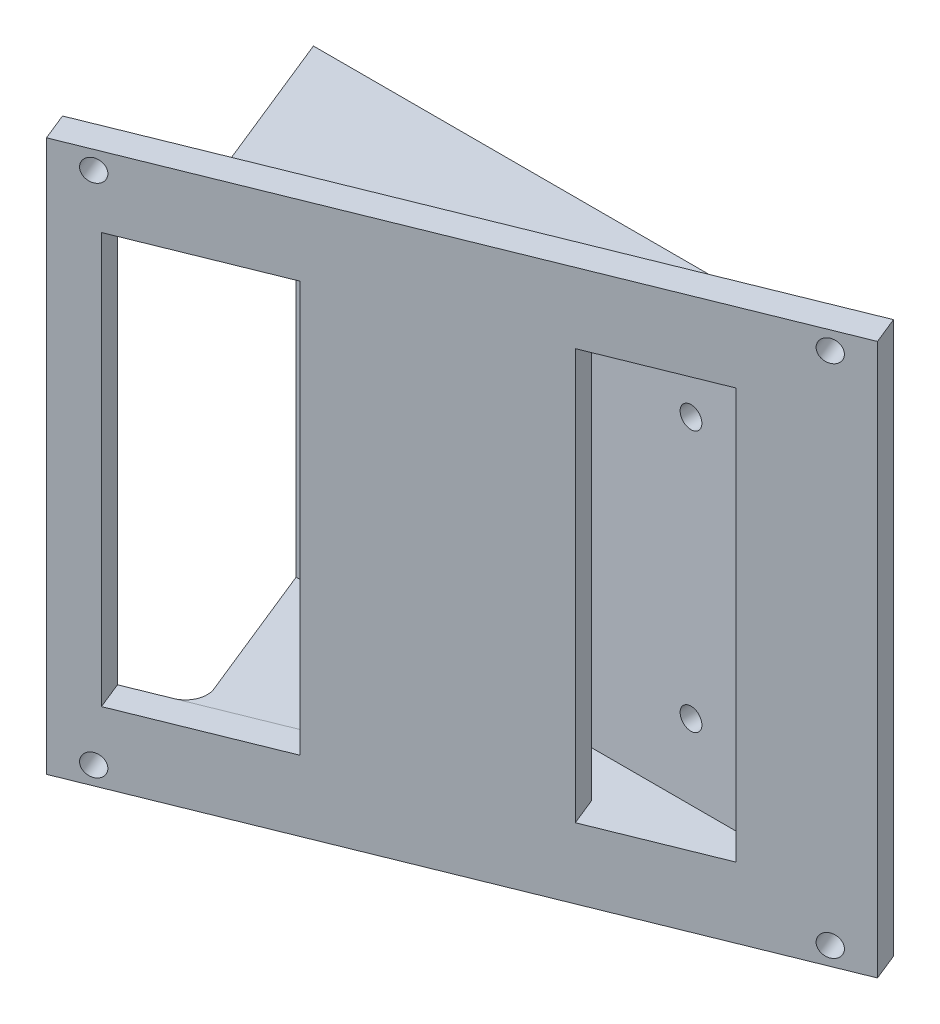
ISO-10303-21;
HEADER;
FILE_DESCRIPTION(('STEP AP214'),'2;1');
FILE_NAME('part.step','',(''),(''),'','','');
FILE_SCHEMA(('AUTOMOTIVE_DESIGN { 1 0 10303 214 1 1 1 1 }'));
ENDSEC;
DATA;
#1=APPLICATION_CONTEXT('core data for automotive mechanical design processes');
#2=APPLICATION_PROTOCOL_DEFINITION('international standard','automotive_design',2000,#1);
#3=PRODUCT_CONTEXT('',#1,'mechanical');
#4=PRODUCT('Part','Part','',(#3));
#5=PRODUCT_RELATED_PRODUCT_CATEGORY('part','',(#4));
#6=PRODUCT_DEFINITION_FORMATION('','',#4);
#7=PRODUCT_DEFINITION_CONTEXT('part definition',#1,'design');
#8=PRODUCT_DEFINITION('design','',#6,#7);
#9=PRODUCT_DEFINITION_SHAPE('','',#8);
#10=(LENGTH_UNIT() NAMED_UNIT(*) SI_UNIT(.MILLI.,.METRE.));
#11=(NAMED_UNIT(*) PLANE_ANGLE_UNIT() SI_UNIT($,.RADIAN.));
#12=(NAMED_UNIT(*) SI_UNIT($,.STERADIAN.) SOLID_ANGLE_UNIT());
#13=UNCERTAINTY_MEASURE_WITH_UNIT(LENGTH_MEASURE(1.E-05),#10,'distance_accuracy_value','');
#14=(GEOMETRIC_REPRESENTATION_CONTEXT(3) GLOBAL_UNCERTAINTY_ASSIGNED_CONTEXT((#13)) GLOBAL_UNIT_ASSIGNED_CONTEXT((#10,
#11,#12)) REPRESENTATION_CONTEXT('',''));
#15=CARTESIAN_POINT('',(0.,0.,0.));
#16=DIRECTION('',(0.,0.,1.));
#17=DIRECTION('',(1.,0.,0.));
#18=AXIS2_PLACEMENT_3D('',#15,#16,#17);
#19=CARTESIAN_POINT('',(-25.5235857504545,-32.41699308692,24.166235419299));
#20=DIRECTION('',(0.,-1.,0.));
#21=DIRECTION('',(0.,0.,-1.));
#22=AXIS2_PLACEMENT_3D('',#19,#20,#21);
#23=CYLINDRICAL_SURFACE('',#22,3.);
#24=DIRECTION('',(0.,1.,0.));
#25=VECTOR('',#24,1.);
#26=CARTESIAN_POINT('',(-22.7420684137299,-32.41699308692,23.0423309280274));
#27=LINE('',#26,#25);
#28=CARTESIAN_POINT('',(-22.7420684137299,28.28300691308,23.0423309280274));
#29=VERTEX_POINT('',#28);
#30=CARTESIAN_POINT('',(-22.7420684137299,32.28300691308,23.0423309280274));
#31=VERTEX_POINT('',#30);
#32=EDGE_CURVE('E192',#29,#31,#27,.T.);
#33=ORIENTED_EDGE('',*,*,#32,.F.);
#34=CARTESIAN_POINT('',(-25.5235857504545,28.28300691308,24.166235419299));
#35=DIRECTION('',(0.,1.,0.));
#36=DIRECTION('',(0.,0.,1.));
#37=AXIS2_PLACEMENT_3D('',#34,#35,#36);
#38=CIRCLE('',#37,3.);
#39=CARTESIAN_POINT('',(-24.399681259183,28.28300691308,26.9477527560236));
#40=VERTEX_POINT('',#39);
#41=EDGE_CURVE('E42',#29,#40,#38,.F.);
#42=ORIENTED_EDGE('',*,*,#41,.T.);
#43=DIRECTION('',(0.,1.,0.));
#44=VECTOR('',#43,1.);
#45=CARTESIAN_POINT('',(-24.399681259183,-32.41699308692,26.9477527560236));
#46=LINE('',#45,#44);
#47=CARTESIAN_POINT('',(-24.399681259183,35.28300691308,26.9477527560236));
#48=VERTEX_POINT('',#47);
#49=EDGE_CURVE('E281',#48,#40,#46,.F.);
#50=ORIENTED_EDGE('',*,*,#49,.F.);
#51=CARTESIAN_POINT('',(-25.5235857504545,35.28300691308,24.166235419299));
#52=DIRECTION('',(-0.655609923595307,-0.707106781186547,0.26490682906138));
#53=DIRECTION('',(-0.655609923595307,0.707106781186547,0.26490682906138));
#54=AXIS2_PLACEMENT_3D('',#51,#52,#53);
#55=ELLIPSE('',#54,4.24264068711928,3.);
#56=EDGE_CURVE('E11',#48,#31,#55,.F.);
#57=ORIENTED_EDGE('',*,*,#56,.T.);
#58=EDGE_LOOP('',(#33,#42,#50,#57));
#59=FACE_BOUND('',#58,.T.);
#60=ADVANCED_FACE('F35',(#59),#23,.F.);
#61=CARTESIAN_POINT('',(-25.5235857504545,-32.41699308692,24.166235419299));
#62=DIRECTION('',(0.,-1.,0.));
#63=DIRECTION('',(0.,0.,-1.));
#64=AXIS2_PLACEMENT_3D('',#61,#62,#63);
#65=CYLINDRICAL_SURFACE('',#64,3.);
#66=DIRECTION('',(0.,1.,0.));
#67=VECTOR('',#66,1.);
#68=CARTESIAN_POINT('',(-22.7420684137299,-32.41699308692,23.0423309280274));
#69=LINE('',#68,#67);
#70=CARTESIAN_POINT('',(-22.7420684137299,-32.319785640601,23.0423309280274));
#71=VERTEX_POINT('',#70);
#72=CARTESIAN_POINT('',(-22.7420684137299,-28.319785640601,23.0423309280274));
#73=VERTEX_POINT('',#72);
#74=EDGE_CURVE('E269',#71,#73,#69,.T.);
#75=ORIENTED_EDGE('',*,*,#74,.F.);
#76=CARTESIAN_POINT('',(-25.5235857504545,-35.319785640601,24.166235419299));
#77=DIRECTION('',(0.655609923595307,-0.707106781186547,-0.26490682906138));
#78=DIRECTION('',(0.655609923595307,0.707106781186547,-0.26490682906138));
#79=AXIS2_PLACEMENT_3D('',#76,#77,#78);
#80=ELLIPSE('',#79,4.24264068711928,3.);
#81=CARTESIAN_POINT('',(-24.399681259183,-35.319785640601,26.9477527560236));
#82=VERTEX_POINT('',#81);
#83=EDGE_CURVE('E275',#71,#82,#80,.T.);
#84=ORIENTED_EDGE('',*,*,#83,.T.);
#85=DIRECTION('',(0.,1.,0.));
#86=VECTOR('',#85,1.);
#87=CARTESIAN_POINT('',(-24.399681259183,-32.41699308692,26.9477527560236));
#88=LINE('',#87,#86);
#89=CARTESIAN_POINT('',(-24.399681259183,-28.319785640601,26.9477527560236));
#90=VERTEX_POINT('',#89);
#91=EDGE_CURVE('E272',#90,#82,#88,.F.);
#92=ORIENTED_EDGE('',*,*,#91,.F.);
#93=CARTESIAN_POINT('',(-25.5235857504545,-28.319785640601,24.166235419299));
#94=DIRECTION('',(0.,-1.,0.));
#95=DIRECTION('',(0.,0.,-1.));
#96=AXIS2_PLACEMENT_3D('',#93,#94,#95);
#97=CIRCLE('',#96,3.);
#98=EDGE_CURVE('E278',#90,#73,#97,.F.);
#99=ORIENTED_EDGE('',*,*,#98,.T.);
#100=EDGE_LOOP('',(#75,#84,#92,#99));
#101=FACE_BOUND('',#100,.T.);
#102=ADVANCED_FACE('F429',(#101),#65,.F.);
#103=CARTESIAN_POINT('',(31.2691156093684,-35.319785640601,1.21848266327538));
#104=DIRECTION('',(0.927172445574872,0.,-0.374634830423855));
#105=DIRECTION('',(-0.374634830423855,0.,-0.927172445574872));
#106=AXIS2_PLACEMENT_3D('',#103,#104,#105);
#107=CYLINDRICAL_SURFACE('',#106,3.);
#108=DIRECTION('',(-0.927172445574872,0.,0.374634830423855));
#109=VECTOR('',#108,1.);
#110=CARTESIAN_POINT('',(31.2691156093684,-32.319785640601,1.21848266327538));
#111=LINE('',#110,#109);
#112=CARTESIAN_POINT('',(32.6585199770549,-32.319785640601,0.657077638608544));
#113=VERTEX_POINT('',#112);
#114=EDGE_CURVE('E254',#113,#71,#111,.T.);
#115=ORIENTED_EDGE('',*,*,#114,.F.);
#116=CARTESIAN_POINT('',(35.4400373137795,-35.319785640601,-0.466826852663024));
#117=DIRECTION('',(-0.655609923595307,-0.707106781186547,0.26490682906138));
#118=DIRECTION('',(0.655609923595307,-0.707106781186547,-0.26490682906138));
#119=AXIS2_PLACEMENT_3D('',#116,#117,#118);
#120=ELLIPSE('',#119,4.24264068711928,3.);
#121=CARTESIAN_POINT('',(36.5639418050511,-35.319785640601,2.31469048406159));
#122=VERTEX_POINT('',#121);
#123=EDGE_CURVE('E266',#113,#122,#120,.F.);
#124=ORIENTED_EDGE('',*,*,#123,.T.);
#125=DIRECTION('',(-0.927172445574872,0.,0.374634830423855));
#126=VECTOR('',#125,1.);
#127=CARTESIAN_POINT('',(32.39302010064,-35.319785640601,4.));
#128=LINE('',#127,#126);
#129=EDGE_CURVE('E262',#82,#122,#128,.F.);
#130=ORIENTED_EDGE('',*,*,#129,.F.);
#131=ORIENTED_EDGE('',*,*,#83,.F.);
#132=EDGE_LOOP('',(#115,#124,#130,#131));
#133=FACE_BOUND('',#132,.T.);
#134=ADVANCED_FACE('F244',(#133),#107,.F.);
#135=CARTESIAN_POINT('',(31.2691156093684,35.28300691308,1.21848266327538));
#136=DIRECTION('',(-0.927172445574872,0.,0.374634830423855));
#137=DIRECTION('',(0.374634830423855,0.,0.927172445574872));
#138=AXIS2_PLACEMENT_3D('',#135,#136,#137);
#139=CYLINDRICAL_SURFACE('',#138,3.);
#140=CARTESIAN_POINT('',(32.39302010064,35.280214359399,0.764355957386201));
#141=DIRECTION('',(-0.927172445574872,0.,0.374634830423855));
#142=DIRECTION('',(0.,-1.,0.));
#143=AXIS2_PLACEMENT_3D('',#140,#141,#142);
#144=CIRCLE('',#143,3.);
#145=CARTESIAN_POINT('',(32.39302010064,32.2816106362395,0.764355957386206));
#146=VERTEX_POINT('',#145);
#147=CARTESIAN_POINT('',(33.5169245919116,35.280214359399,3.54587329411082));
#148=VERTEX_POINT('',#147);
#149=EDGE_CURVE('E509',#146,#148,#144,.T.);
#150=ORIENTED_EDGE('',*,*,#149,.F.);
#151=DIRECTION('',(0.927172445574872,0.,-0.374634830423855));
#152=VECTOR('',#151,1.);
#153=CARTESIAN_POINT('',(31.2691156093684,32.28300691308,1.21848266327538));
#154=LINE('',#153,#152);
#155=EDGE_CURVE('E490',#31,#146,#154,.T.);
#156=ORIENTED_EDGE('',*,*,#155,.F.);
#157=ORIENTED_EDGE('',*,*,#56,.F.);
#158=DIRECTION('',(0.927172445574872,0.,-0.374634830423855));
#159=VECTOR('',#158,1.);
#160=CARTESIAN_POINT('',(32.39302010064,35.28300691308,4.));
#161=LINE('',#160,#159);
#162=EDGE_CURVE('E49',#148,#48,#161,.F.);
#163=ORIENTED_EDGE('',*,*,#162,.F.);
#164=EDGE_LOOP('',(#150,#156,#157,#163));
#165=FACE_BOUND('',#164,.T.);
#166=ADVANCED_FACE('F240',(#165),#139,.F.);
#167=CARTESIAN_POINT('',(4.81190093857322,35.280214359399,11.9088285412046));
#168=DIRECTION('',(-0.927172445574872,0.,0.374634830423855));
#169=DIRECTION('',(0.374634830423855,0.,0.927172445574872));
#170=AXIS2_PLACEMENT_3D('',#167,#168,#169);
#171=CYLINDRICAL_SURFACE('',#170,3.);
#172=DIRECTION('',(0.927172445574872,0.,-0.374634830423855));
#173=VECTOR('',#172,1.);
#174=CARTESIAN_POINT('',(4.81190093857322,32.280214359399,11.9088285412046));
#175=LINE('',#174,#173);
#176=CARTESIAN_POINT('',(32.6585199770549,32.280214359399,0.657077638608544));
#177=VERTEX_POINT('',#176);
#178=EDGE_CURVE('E505',#146,#177,#175,.T.);
#179=ORIENTED_EDGE('',*,*,#178,.F.);
#180=ORIENTED_EDGE('',*,*,#149,.T.);
#181=DIRECTION('',(0.927172445574872,0.,-0.374634830423855));
#182=VECTOR('',#181,1.);
#183=CARTESIAN_POINT('',(5.93580542984478,35.280214359399,14.6903458779292));
#184=LINE('',#183,#182);
#185=CARTESIAN_POINT('',(36.5639418050511,35.280214359399,2.31469048406159));
#186=VERTEX_POINT('',#185);
#187=EDGE_CURVE('E492',#186,#148,#184,.F.);
#188=ORIENTED_EDGE('',*,*,#187,.F.);
#189=CARTESIAN_POINT('',(35.4400373137795,35.280214359399,-0.466826852663025));
#190=DIRECTION('',(0.655609923595307,-0.707106781186547,-0.26490682906138));
#191=DIRECTION('',(-0.655609923595307,-0.707106781186547,0.26490682906138));
#192=AXIS2_PLACEMENT_3D('',#189,#190,#191);
#193=ELLIPSE('',#192,4.24264068711928,3.);
#194=EDGE_CURVE('E263',#186,#177,#193,.T.);
#195=ORIENTED_EDGE('',*,*,#194,.T.);
#196=EDGE_LOOP('',(#179,#180,#188,#195));
#197=FACE_BOUND('',#196,.T.);
#198=ADVANCED_FACE('F238',(#197),#171,.F.);
#199=CARTESIAN_POINT('',(35.4400373137795,32.280214359399,-0.466826852663024));
#200=DIRECTION('',(0.,-1.,0.));
#201=DIRECTION('',(0.,0.,-1.));
#202=AXIS2_PLACEMENT_3D('',#199,#200,#201);
#203=CYLINDRICAL_SURFACE('',#202,3.);
#204=DIRECTION('',(0.,-1.,0.));
#205=VECTOR('',#204,1.);
#206=CARTESIAN_POINT('',(32.6585199770549,32.280214359399,0.657077638608543));
#207=LINE('',#206,#205);
#208=EDGE_CURVE('E486',#177,#113,#207,.T.);
#209=ORIENTED_EDGE('',*,*,#208,.F.);
#210=ORIENTED_EDGE('',*,*,#194,.F.);
#211=DIRECTION('',(0.,-1.,0.));
#212=VECTOR('',#211,1.);
#213=CARTESIAN_POINT('',(36.5639418050511,0.,2.31469048406159));
#214=LINE('',#213,#212);
#215=EDGE_CURVE('E488',#122,#186,#214,.F.);
#216=ORIENTED_EDGE('',*,*,#215,.F.);
#217=ORIENTED_EDGE('',*,*,#123,.F.);
#218=EDGE_LOOP('',(#209,#210,#216,#217));
#219=FACE_BOUND('',#218,.T.);
#220=ADVANCED_FACE('F235',(#219),#203,.F.);
#221=CARTESIAN_POINT('',(0.,0.,4.));
#222=DIRECTION('',(0.,0.,1.));
#223=DIRECTION('',(1.,0.,0.));
#224=AXIS2_PLACEMENT_3D('',#221,#222,#223);
#225=PLANE('',#224);
#226=DIRECTION('',(0.,1.,0.));
#227=VECTOR('',#226,1.);
#228=CARTESIAN_POINT('',(-30.4363441141615,0.,4.));
#229=LINE('',#228,#227);
#230=CARTESIAN_POINT('',(-30.4363441141615,-28.319785640601,4.));
#231=VERTEX_POINT('',#230);
#232=CARTESIAN_POINT('',(-30.4363441141615,28.28300691308,4.));
#233=VERTEX_POINT('',#232);
#234=EDGE_CURVE('E437',#231,#233,#229,.T.);
#235=ORIENTED_EDGE('',*,*,#234,.F.);
#236=DIRECTION('',(1.,0.,0.));
#237=VECTOR('',#236,1.);
#238=CARTESIAN_POINT('',(-32.0525907237836,-28.319785640601,4.));
#239=LINE('',#238,#237);
#240=CARTESIAN_POINT('',(32.39302010064,-28.319785640601,4.));
#241=VERTEX_POINT('',#240);
#242=EDGE_CURVE('E522',#231,#241,#239,.T.);
#243=ORIENTED_EDGE('',*,*,#242,.T.);
#244=DIRECTION('',(0.,1.,0.));
#245=VECTOR('',#244,1.);
#246=CARTESIAN_POINT('',(32.39302010064,-32.319785640601,4.));
#247=LINE('',#246,#245);
#248=CARTESIAN_POINT('',(32.39302010064,28.28300691308,4.));
#249=VERTEX_POINT('',#248);
#250=EDGE_CURVE('E213',#241,#249,#247,.T.);
#251=ORIENTED_EDGE('',*,*,#250,.T.);
#252=DIRECTION('',(-1.,0.,0.));
#253=VECTOR('',#252,1.);
#254=CARTESIAN_POINT('',(-32.0525907237836,28.28300691308,4.));
#255=LINE('',#254,#253);
#256=EDGE_CURVE('E523',#249,#233,#255,.T.);
#257=ORIENTED_EDGE('',*,*,#256,.T.);
#258=EDGE_LOOP('',(#235,#243,#251,#257));
#259=FACE_BOUND('',#258,.T.);
#260=CARTESIAN_POINT('',(24.,18.,4.));
#261=DIRECTION('',(0.,0.,1.));
#262=DIRECTION('',(1.,0.,0.));
#263=AXIS2_PLACEMENT_3D('',#260,#261,#262);
#264=CIRCLE('',#263,1.5);
#265=CARTESIAN_POINT('',(25.5,18.,4.));
#266=VERTEX_POINT('',#265);
#267=EDGE_CURVE('E851',#266,#266,#264,.T.);
#268=ORIENTED_EDGE('',*,*,#267,.F.);
#269=EDGE_LOOP('',(#268));
#270=FACE_BOUND('',#269,.T.);
#271=CARTESIAN_POINT('',(-24.,18.,4.));
#272=DIRECTION('',(0.,0.,1.));
#273=DIRECTION('',(1.,0.,0.));
#274=AXIS2_PLACEMENT_3D('',#271,#272,#273);
#275=CIRCLE('',#274,1.5);
#276=CARTESIAN_POINT('',(-22.5,18.,4.));
#277=VERTEX_POINT('',#276);
#278=EDGE_CURVE('E855',#277,#277,#275,.T.);
#279=ORIENTED_EDGE('',*,*,#278,.F.);
#280=EDGE_LOOP('',(#279));
#281=FACE_BOUND('',#280,.T.);
#282=CARTESIAN_POINT('',(-24.,-18.,4.));
#283=DIRECTION('',(0.,0.,1.));
#284=DIRECTION('',(1.,0.,0.));
#285=AXIS2_PLACEMENT_3D('',#282,#283,#284);
#286=CIRCLE('',#285,1.5);
#287=CARTESIAN_POINT('',(-22.5,-18.,4.));
#288=VERTEX_POINT('',#287);
#289=EDGE_CURVE('E859',#288,#288,#286,.T.);
#290=ORIENTED_EDGE('',*,*,#289,.F.);
#291=EDGE_LOOP('',(#290));
#292=FACE_BOUND('',#291,.T.);
#293=CARTESIAN_POINT('',(24.,-18.,4.));
#294=DIRECTION('',(0.,0.,1.));
#295=DIRECTION('',(1.,0.,0.));
#296=AXIS2_PLACEMENT_3D('',#293,#294,#295);
#297=CIRCLE('',#296,1.5);
#298=CARTESIAN_POINT('',(25.5,-18.,4.));
#299=VERTEX_POINT('',#298);
#300=EDGE_CURVE('E862',#299,#299,#297,.T.);
#301=ORIENTED_EDGE('',*,*,#300,.F.);
#302=EDGE_LOOP('',(#301));
#303=FACE_BOUND('',#302,.T.);
#304=ADVANCED_FACE('F233',(#259,#270,#281,#292,#303),#225,.T.);
#305=CARTESIAN_POINT('',(32.39302010064,32.28300691308,4.));
#306=DIRECTION('',(0.,-1.,0.));
#307=DIRECTION('',(0.,0.,-1.));
#308=AXIS2_PLACEMENT_3D('',#305,#306,#307);
#309=PLANE('',#308);
#310=DIRECTION('',(-0.374634830423855,0.,-0.927172445574872));
#311=VECTOR('',#310,1.);
#312=CARTESIAN_POINT('',(-32.0525907237836,32.28300691308,0.));
#313=LINE('',#312,#311);
#314=CARTESIAN_POINT('',(-32.0525907237836,32.28300691308,0.));
#315=VERTEX_POINT('',#314);
#316=EDGE_CURVE('E184',#31,#315,#313,.T.);
#317=ORIENTED_EDGE('',*,*,#316,.F.);
#318=ORIENTED_EDGE('',*,*,#155,.T.);
#319=CARTESIAN_POINT('',(32.39302010064,32.28300691308,0.764355957386206));
#320=DIRECTION('',(0.,0.,-1.));
#321=VECTOR('',#320,1.);
#322=LINE('',#319,#321);
#323=CARTESIAN_POINT('',(32.39302010064,32.2816106362395,0.));
#324=VERTEX_POINT('',#323);
#325=EDGE_CURVE('E203',#146,#324,#322,.T.);
#326=ORIENTED_EDGE('',*,*,#325,.T.);
#327=DIRECTION('',(-1.,0.,0.));
#328=VECTOR('',#327,1.);
#329=CARTESIAN_POINT('',(32.39302010064,32.28300691308,0.));
#330=LINE('',#329,#328);
#331=EDGE_CURVE('E200',#324,#315,#330,.T.);
#332=ORIENTED_EDGE('',*,*,#331,.T.);
#333=EDGE_LOOP('',(#317,#318,#326,#332));
#334=FACE_BOUND('',#333,.T.);
#335=ADVANCED_FACE('F201',(#334),#309,.F.);
#336=CARTESIAN_POINT('',(32.39302010064,-32.319785640601,4.));
#337=DIRECTION('',(0.,1.,0.));
#338=DIRECTION('',(0.,0.,1.));
#339=AXIS2_PLACEMENT_3D('',#336,#337,#338);
#340=PLANE('',#339);
#341=DIRECTION('',(0.374634830423856,0.,0.927172445574872));
#342=VECTOR('',#341,1.);
#343=CARTESIAN_POINT('',(32.39302010064,-32.319785640601,0.));
#344=LINE('',#343,#342);
#345=CARTESIAN_POINT('',(32.39302010064,-32.319785640601,0.));
#346=VERTEX_POINT('',#345);
#347=EDGE_CURVE('E369',#346,#113,#344,.T.);
#348=ORIENTED_EDGE('',*,*,#347,.T.);
#349=ORIENTED_EDGE('',*,*,#114,.T.);
#350=DIRECTION('',(-0.374634830423855,0.,-0.927172445574872));
#351=VECTOR('',#350,1.);
#352=CARTESIAN_POINT('',(-21.6181639224583,-32.319785640601,25.823848264752));
#353=LINE('',#352,#351);
#354=CARTESIAN_POINT('',(-32.0525907237836,-32.319785640601,0.));
#355=VERTEX_POINT('',#354);
#356=EDGE_CURVE('E299',#71,#355,#353,.T.);
#357=ORIENTED_EDGE('',*,*,#356,.T.);
#358=DIRECTION('',(1.,0.,0.));
#359=VECTOR('',#358,1.);
#360=CARTESIAN_POINT('',(32.39302010064,-32.319785640601,0.));
#361=LINE('',#360,#359);
#362=EDGE_CURVE('E211',#355,#346,#361,.T.);
#363=ORIENTED_EDGE('',*,*,#362,.T.);
#364=EDGE_LOOP('',(#348,#349,#357,#363));
#365=FACE_BOUND('',#364,.T.);
#366=ADVANCED_FACE('F232',(#365),#340,.F.);
#367=CARTESIAN_POINT('',(0.,0.,0.));
#368=DIRECTION('',(0.,0.,1.));
#369=DIRECTION('',(1.,0.,0.));
#370=AXIS2_PLACEMENT_3D('',#367,#368,#369);
#371=PLANE('',#370);
#372=CARTESIAN_POINT('',(24.,18.,0.));
#373=DIRECTION('',(0.,0.,1.));
#374=DIRECTION('',(1.,0.,0.));
#375=AXIS2_PLACEMENT_3D('',#372,#373,#374);
#376=CIRCLE('',#375,1.5);
#377=CARTESIAN_POINT('',(25.5,18.,0.));
#378=VERTEX_POINT('',#377);
#379=EDGE_CURVE('E526',#378,#378,#376,.T.);
#380=ORIENTED_EDGE('',*,*,#379,.T.);
#381=EDGE_LOOP('',(#380));
#382=FACE_BOUND('',#381,.T.);
#383=CARTESIAN_POINT('',(-24.,18.,0.));
#384=DIRECTION('',(0.,0.,1.));
#385=DIRECTION('',(1.,0.,0.));
#386=AXIS2_PLACEMENT_3D('',#383,#384,#385);
#387=CIRCLE('',#386,1.5);
#388=CARTESIAN_POINT('',(-22.5,18.,0.));
#389=VERTEX_POINT('',#388);
#390=EDGE_CURVE('E869',#389,#389,#387,.T.);
#391=ORIENTED_EDGE('',*,*,#390,.T.);
#392=EDGE_LOOP('',(#391));
#393=FACE_BOUND('',#392,.T.);
#394=CARTESIAN_POINT('',(-24.,-18.,0.));
#395=DIRECTION('',(0.,0.,1.));
#396=DIRECTION('',(1.,0.,0.));
#397=AXIS2_PLACEMENT_3D('',#394,#395,#396);
#398=CIRCLE('',#397,1.5);
#399=CARTESIAN_POINT('',(-22.5,-18.,0.));
#400=VERTEX_POINT('',#399);
#401=EDGE_CURVE('E873',#400,#400,#398,.T.);
#402=ORIENTED_EDGE('',*,*,#401,.T.);
#403=EDGE_LOOP('',(#402));
#404=FACE_BOUND('',#403,.T.);
#405=CARTESIAN_POINT('',(24.,-18.,0.));
#406=DIRECTION('',(0.,0.,1.));
#407=DIRECTION('',(1.,0.,0.));
#408=AXIS2_PLACEMENT_3D('',#405,#406,#407);
#409=CIRCLE('',#408,1.5);
#410=CARTESIAN_POINT('',(25.5,-18.,0.));
#411=VERTEX_POINT('',#410);
#412=EDGE_CURVE('E863',#411,#411,#409,.T.);
#413=ORIENTED_EDGE('',*,*,#412,.T.);
#414=EDGE_LOOP('',(#413));
#415=FACE_BOUND('',#414,.T.);
#416=DIRECTION('',(0.,1.,0.));
#417=VECTOR('',#416,1.);
#418=CARTESIAN_POINT('',(32.39302010064,-32.319785640601,0.));
#419=LINE('',#418,#417);
#420=EDGE_CURVE('E207',#346,#324,#419,.T.);
#421=ORIENTED_EDGE('',*,*,#420,.F.);
#422=ORIENTED_EDGE('',*,*,#362,.F.);
#423=DIRECTION('',(0.,-1.,0.));
#424=VECTOR('',#423,1.);
#425=CARTESIAN_POINT('',(-32.0525907237836,-32.319785640601,0.));
#426=LINE('',#425,#424);
#427=EDGE_CURVE('E190',#315,#355,#426,.T.);
#428=ORIENTED_EDGE('',*,*,#427,.F.);
#429=ORIENTED_EDGE('',*,*,#331,.F.);
#430=EDGE_LOOP('',(#421,#422,#428,#429));
#431=FACE_BOUND('',#430,.T.);
#432=ADVANCED_FACE('F209',(#382,#393,#404,#415,#431),#371,.F.);
#433=CARTESIAN_POINT('',(24.,-18.,4.));
#434=DIRECTION('',(0.,0.,-1.));
#435=DIRECTION('',(-1.,0.,0.));
#436=AXIS2_PLACEMENT_3D('',#433,#434,#435);
#437=CYLINDRICAL_SURFACE('',#436,1.5);
#438=ORIENTED_EDGE('',*,*,#300,.T.);
#439=EDGE_LOOP('',(#438));
#440=FACE_BOUND('',#439,.T.);
#441=ORIENTED_EDGE('',*,*,#412,.F.);
#442=EDGE_LOOP('',(#441));
#443=FACE_BOUND('',#442,.T.);
#444=ADVANCED_FACE('F407',(#440,#443),#437,.F.);
#445=CARTESIAN_POINT('',(-24.,-18.,4.));
#446=DIRECTION('',(0.,0.,-1.));
#447=DIRECTION('',(-1.,0.,0.));
#448=AXIS2_PLACEMENT_3D('',#445,#446,#447);
#449=CYLINDRICAL_SURFACE('',#448,1.5);
#450=ORIENTED_EDGE('',*,*,#289,.T.);
#451=EDGE_LOOP('',(#450));
#452=FACE_BOUND('',#451,.T.);
#453=ORIENTED_EDGE('',*,*,#401,.F.);
#454=EDGE_LOOP('',(#453));
#455=FACE_BOUND('',#454,.T.);
#456=ADVANCED_FACE('F403',(#452,#455),#449,.F.);
#457=CARTESIAN_POINT('',(-24.,18.,4.));
#458=DIRECTION('',(0.,0.,-1.));
#459=DIRECTION('',(-1.,0.,0.));
#460=AXIS2_PLACEMENT_3D('',#457,#458,#459);
#461=CYLINDRICAL_SURFACE('',#460,1.5);
#462=ORIENTED_EDGE('',*,*,#278,.T.);
#463=EDGE_LOOP('',(#462));
#464=FACE_BOUND('',#463,.T.);
#465=ORIENTED_EDGE('',*,*,#390,.F.);
#466=EDGE_LOOP('',(#465));
#467=FACE_BOUND('',#466,.T.);
#468=ADVANCED_FACE('F406',(#464,#467),#461,.F.);
#469=CARTESIAN_POINT('',(24.,18.,4.));
#470=DIRECTION('',(0.,0.,-1.));
#471=DIRECTION('',(-1.,0.,0.));
#472=AXIS2_PLACEMENT_3D('',#469,#470,#471);
#473=CYLINDRICAL_SURFACE('',#472,1.5);
#474=ORIENTED_EDGE('',*,*,#267,.T.);
#475=EDGE_LOOP('',(#474));
#476=FACE_BOUND('',#475,.T.);
#477=ORIENTED_EDGE('',*,*,#379,.F.);
#478=EDGE_LOOP('',(#477));
#479=FACE_BOUND('',#478,.T.);
#480=ADVANCED_FACE('F402',(#476,#479),#473,.F.);
#481=CARTESIAN_POINT('',(0.,28.28300691308,0.));
#482=DIRECTION('',(0.,1.,0.));
#483=DIRECTION('',(0.,0.,1.));
#484=AXIS2_PLACEMENT_3D('',#481,#482,#483);
#485=PLANE('',#484);
#486=ORIENTED_EDGE('',*,*,#41,.F.);
#487=DIRECTION('',(-0.374634830423855,0.,-0.927172445574872));
#488=VECTOR('',#487,1.);
#489=CARTESIAN_POINT('',(-27.5539693523031,28.28300691308,11.1335023868228));
#490=LINE('',#489,#488);
#491=EDGE_CURVE('E435',#29,#233,#490,.T.);
#492=ORIENTED_EDGE('',*,*,#491,.T.);
#493=ORIENTED_EDGE('',*,*,#256,.F.);
#494=DIRECTION('',(-0.374634830423855,0.,-0.927172445574872));
#495=VECTOR('',#494,1.);
#496=CARTESIAN_POINT('',(33.8915594223354,28.28300691308,7.70868978229949));
#497=LINE('',#496,#495);
#498=CARTESIAN_POINT('',(33.8915594223354,28.28300691308,7.70868978229949));
#499=VERTEX_POINT('',#498);
#500=EDGE_CURVE('E334',#499,#249,#497,.T.);
#501=ORIENTED_EDGE('',*,*,#500,.F.);
#502=DIRECTION('',(-0.927172445574872,0.,0.374634830423855));
#503=VECTOR('',#502,1.);
#504=CARTESIAN_POINT('',(33.8915594223354,28.28300691308,7.70868978229949));
#505=LINE('',#504,#503);
#506=CARTESIAN_POINT('',(18.1296278475626,28.28300691308,14.077481899505));
#507=VERTEX_POINT('',#506);
#508=EDGE_CURVE('E318',#499,#507,#505,.T.);
#509=ORIENTED_EDGE('',*,*,#508,.T.);
#510=DIRECTION('',(-0.374634830423855,0.,-0.927172445574872));
#511=VECTOR('',#510,1.);
#512=CARTESIAN_POINT('',(18.1296278475626,28.28300691308,14.077481899505));
#513=LINE('',#512,#511);
#514=CARTESIAN_POINT('',(16.6310885258672,28.28300691308,10.3687921172055));
#515=VERTEX_POINT('',#514);
#516=EDGE_CURVE('E331',#507,#515,#513,.T.);
#517=ORIENTED_EDGE('',*,*,#516,.T.);
#518=DIRECTION('',(0.927172445574872,0.,-0.374634830423855));
#519=VECTOR('',#518,1.);
#520=CARTESIAN_POINT('',(5.93580542984478,28.28300691308,14.6903458779292));
#521=LINE('',#520,#519);
#522=CARTESIAN_POINT('',(-10.4250155013833,28.28300691308,21.3011262181121));
#523=VERTEX_POINT('',#522);
#524=EDGE_CURVE('E367',#523,#515,#521,.T.);
#525=ORIENTED_EDGE('',*,*,#524,.F.);
#526=DIRECTION('',(-0.374634830423855,0.,-0.927172445574872));
#527=VECTOR('',#526,1.);
#528=CARTESIAN_POINT('',(-8.92647617968786,28.28300691308,25.0098160004116));
#529=LINE('',#528,#527);
#530=CARTESIAN_POINT('',(-8.92647617968786,28.28300691308,25.0098160004116));
#531=VERTEX_POINT('',#530);
#532=EDGE_CURVE('E312',#531,#523,#529,.T.);
#533=ORIENTED_EDGE('',*,*,#532,.F.);
#534=DIRECTION('',(-0.927172445574872,0.,0.374634830423855));
#535=VECTOR('',#534,1.);
#536=CARTESIAN_POINT('',(-8.92647617968786,28.28300691308,25.0098160004116));
#537=LINE('',#536,#535);
#538=CARTESIAN_POINT('',(-28.3970975367602,28.28300691308,32.8771474393126));
#539=VERTEX_POINT('',#538);
#540=EDGE_CURVE('E446',#531,#539,#537,.T.);
#541=ORIENTED_EDGE('',*,*,#540,.T.);
#542=DIRECTION('',(-0.374634830423855,0.,-0.927172445574872));
#543=VECTOR('',#542,1.);
#544=CARTESIAN_POINT('',(-28.3970975367602,28.28300691308,32.8771474393126));
#545=LINE('',#544,#543);
#546=CARTESIAN_POINT('',(-29.8956368584556,28.28300691308,29.1684576570131));
#547=VERTEX_POINT('',#546);
#548=EDGE_CURVE('E291',#539,#547,#545,.T.);
#549=ORIENTED_EDGE('',*,*,#548,.T.);
#550=DIRECTION('',(-0.927172445574872,0.,0.374634830423855));
#551=VECTOR('',#550,1.);
#552=CARTESIAN_POINT('',(-10.4250155013833,28.28300691308,21.3011262181121));
#553=LINE('',#552,#551);
#554=EDGE_CURVE('E286',#40,#547,#553,.T.);
#555=ORIENTED_EDGE('',*,*,#554,.F.);
#556=EDGE_LOOP('',(#486,#492,#493,#501,#509,#517,#525,#533,#541,#549,#555));
#557=FACE_BOUND('',#556,.T.);
#558=ADVANCED_FACE('F289',(#557),#485,.F.);
#559=CARTESIAN_POINT('',(0.,-28.319785640601,0.));
#560=DIRECTION('',(0.,-1.,0.));
#561=DIRECTION('',(0.,0.,-1.));
#562=AXIS2_PLACEMENT_3D('',#559,#560,#561);
#563=PLANE('',#562);
#564=ORIENTED_EDGE('',*,*,#242,.F.);
#565=DIRECTION('',(0.374634830423855,0.,0.927172445574872));
#566=VECTOR('',#565,1.);
#567=CARTESIAN_POINT('',(-27.5539693523031,-28.319785640601,11.1335023868228));
#568=LINE('',#567,#566);
#569=EDGE_CURVE('E196',#231,#73,#568,.T.);
#570=ORIENTED_EDGE('',*,*,#569,.T.);
#571=ORIENTED_EDGE('',*,*,#98,.F.);
#572=DIRECTION('',(-0.927172445574872,0.,0.374634830423855));
#573=VECTOR('',#572,1.);
#574=CARTESIAN_POINT('',(5.93580542984478,-28.319785640601,14.6903458779292));
#575=LINE('',#574,#573);
#576=CARTESIAN_POINT('',(16.6310885258672,-28.319785640601,10.3687921172055));
#577=VERTEX_POINT('',#576);
#578=EDGE_CURVE('E365',#577,#90,#575,.T.);
#579=ORIENTED_EDGE('',*,*,#578,.F.);
#580=DIRECTION('',(-0.374634830423855,0.,-0.927172445574872));
#581=VECTOR('',#580,1.);
#582=CARTESIAN_POINT('',(18.1296278475626,-28.319785640601,14.077481899505));
#583=LINE('',#582,#581);
#584=CARTESIAN_POINT('',(18.1296278475626,-28.319785640601,14.077481899505));
#585=VERTEX_POINT('',#584);
#586=EDGE_CURVE('E328',#585,#577,#583,.T.);
#587=ORIENTED_EDGE('',*,*,#586,.F.);
#588=DIRECTION('',(0.927172445574872,0.,-0.374634830423855));
#589=VECTOR('',#588,1.);
#590=CARTESIAN_POINT('',(33.8915594223354,-28.319785640601,7.70868978229949));
#591=LINE('',#590,#589);
#592=CARTESIAN_POINT('',(33.8915594223354,-28.319785640601,7.70868978229949));
#593=VERTEX_POINT('',#592);
#594=EDGE_CURVE('E323',#585,#593,#591,.T.);
#595=ORIENTED_EDGE('',*,*,#594,.T.);
#596=DIRECTION('',(-0.374634830423855,0.,-0.927172445574872));
#597=VECTOR('',#596,1.);
#598=CARTESIAN_POINT('',(33.8915594223354,-28.319785640601,7.70868978229949));
#599=LINE('',#598,#597);
#600=EDGE_CURVE('E325',#593,#241,#599,.T.);
#601=ORIENTED_EDGE('',*,*,#600,.T.);
#602=EDGE_LOOP('',(#564,#570,#571,#579,#587,#595,#601));
#603=FACE_BOUND('',#602,.T.);
#604=ADVANCED_FACE('F395',(#603),#563,.F.);
#605=CARTESIAN_POINT('',(32.39302010064,32.280214359399,0.));
#606=DIRECTION('',(0.927172445574872,0.,-0.374634830423856));
#607=DIRECTION('',(-0.374634830423856,0.,-0.927172445574872));
#608=AXIS2_PLACEMENT_3D('',#605,#606,#607);
#609=PLANE('',#608);
#610=DIRECTION('',(0.374634830423856,0.,0.927172445574872));
#611=VECTOR('',#610,1.);
#612=CARTESIAN_POINT('',(32.39302010064,32.280214359399,0.));
#613=LINE('',#612,#611);
#614=EDGE_CURVE('E372',#324,#177,#613,.T.);
#615=ORIENTED_EDGE('',*,*,#614,.T.);
#616=ORIENTED_EDGE('',*,*,#208,.T.);
#617=ORIENTED_EDGE('',*,*,#347,.F.);
#618=ORIENTED_EDGE('',*,*,#420,.T.);
#619=EDGE_LOOP('',(#615,#616,#617,#618));
#620=FACE_BOUND('',#619,.T.);
#621=ADVANCED_FACE('F389',(#620),#609,.T.);
#622=CARTESIAN_POINT('',(0.,32.280214359399,0.));
#623=DIRECTION('',(0.,-1.,0.));
#624=DIRECTION('',(0.,0.,-1.));
#625=AXIS2_PLACEMENT_3D('',#622,#623,#624);
#626=PLANE('',#625);
#627=ORIENTED_EDGE('',*,*,#325,.F.);
#628=ORIENTED_EDGE('',*,*,#178,.T.);
#629=ORIENTED_EDGE('',*,*,#614,.F.);
#630=EDGE_LOOP('',(#627,#628,#629));
#631=FACE_BOUND('',#630,.T.);
#632=ADVANCED_FACE('F379',(#631),#626,.F.);
#633=CARTESIAN_POINT('',(5.93580542984478,0.,14.6903458779292));
#634=DIRECTION('',(0.374634830423855,0.,0.927172445574872));
#635=DIRECTION('',(0.927172445574872,0.,-0.374634830423855));
#636=AXIS2_PLACEMENT_3D('',#633,#634,#635);
#637=PLANE('',#636);
#638=CARTESIAN_POINT('',(41.6627097887025,-35.51699308692,0.254473867354988));
#639=DIRECTION('',(-0.374634830423855,0.,-0.927172445574872));
#640=DIRECTION('',(-0.927172445574872,0.,0.374634830423855));
#641=AXIS2_PLACEMENT_3D('',#638,#639,#640);
#642=CIRCLE('',#641,1.49999999999999);
#643=CARTESIAN_POINT('',(40.2719511203402,-35.51699308692,0.816426112990768));
#644=VERTEX_POINT('',#643);
#645=EDGE_CURVE('E837',#644,#644,#642,.T.);
#646=ORIENTED_EDGE('',*,*,#645,.F.);
#647=EDGE_LOOP('',(#646));
#648=FACE_BOUND('',#647,.T.);
#649=CARTESIAN_POINT('',(-30.6567409661375,35.48300691308,29.4759906404157));
#650=DIRECTION('',(-0.374634830423855,0.,-0.927172445574872));
#651=DIRECTION('',(-0.927172445574872,0.,0.374634830423855));
#652=AXIS2_PLACEMENT_3D('',#649,#650,#651);
#653=CIRCLE('',#652,1.5);
#654=CARTESIAN_POINT('',(-32.0474996344998,35.48300691308,30.0379428860515));
#655=VERTEX_POINT('',#654);
#656=EDGE_CURVE('E839',#655,#655,#653,.T.);
#657=ORIENTED_EDGE('',*,*,#656,.F.);
#658=EDGE_LOOP('',(#657));
#659=FACE_BOUND('',#658,.T.);
#660=CARTESIAN_POINT('',(-30.6567409661375,-35.51699308692,29.4759906404157));
#661=DIRECTION('',(-0.374634830423855,0.,-0.927172445574872));
#662=DIRECTION('',(-0.927172445574872,0.,0.374634830423855));
#663=AXIS2_PLACEMENT_3D('',#660,#661,#662);
#664=CIRCLE('',#663,1.50000000000001);
#665=CARTESIAN_POINT('',(-32.0474996344998,-35.51699308692,30.0379428860515));
#666=VERTEX_POINT('',#665);
#667=EDGE_CURVE('E844',#666,#666,#664,.T.);
#668=ORIENTED_EDGE('',*,*,#667,.F.);
#669=EDGE_LOOP('',(#668));
#670=FACE_BOUND('',#669,.T.);
#671=CARTESIAN_POINT('',(41.6627097887025,35.48300691308,0.254473867354988));
#672=DIRECTION('',(-0.374634830423855,0.,-0.927172445574872));
#673=DIRECTION('',(-0.927172445574872,0.,0.374634830423855));
#674=AXIS2_PLACEMENT_3D('',#671,#672,#673);
#675=CIRCLE('',#674,1.5);
#676=CARTESIAN_POINT('',(40.2719511203402,35.48300691308,0.816426112990771));
#677=VERTEX_POINT('',#676);
#678=EDGE_CURVE('E838',#677,#677,#675,.T.);
#679=ORIENTED_EDGE('',*,*,#678,.F.);
#680=EDGE_LOOP('',(#679));
#681=FACE_BOUND('',#680,.T.);
#682=ORIENTED_EDGE('',*,*,#162,.T.);
#683=ORIENTED_EDGE('',*,*,#49,.T.);
#684=ORIENTED_EDGE('',*,*,#554,.T.);
#685=DIRECTION('',(0.,-1.,0.));
#686=VECTOR('',#685,1.);
#687=CARTESIAN_POINT('',(-29.8956368584556,28.28300691308,29.1684576570131));
#688=LINE('',#687,#686);
#689=CARTESIAN_POINT('',(-29.8956368584556,-28.31699308692,29.1684576570131));
#690=VERTEX_POINT('',#689);
#691=EDGE_CURVE('E293',#547,#690,#688,.T.);
#692=ORIENTED_EDGE('',*,*,#691,.T.);
#693=DIRECTION('',(0.927172445574872,0.,-0.374634830423855));
#694=VECTOR('',#693,1.);
#695=CARTESIAN_POINT('',(-10.4250155013833,-28.31699308692,21.3011262181121));
#696=LINE('',#695,#694);
#697=CARTESIAN_POINT('',(-10.4250155013833,-28.31699308692,21.3011262181121));
#698=VERTEX_POINT('',#697);
#699=EDGE_CURVE('E296',#690,#698,#696,.T.);
#700=ORIENTED_EDGE('',*,*,#699,.T.);
#701=DIRECTION('',(0.,1.,0.));
#702=VECTOR('',#701,1.);
#703=CARTESIAN_POINT('',(-10.4250155013833,28.28300691308,21.3011262181121));
#704=LINE('',#703,#702);
#705=EDGE_CURVE('E294',#698,#523,#704,.T.);
#706=ORIENTED_EDGE('',*,*,#705,.T.);
#707=ORIENTED_EDGE('',*,*,#524,.T.);
#708=DIRECTION('',(0.,-1.,0.));
#709=VECTOR('',#708,1.);
#710=CARTESIAN_POINT('',(16.6310885258672,28.28300691308,10.3687921172055));
#711=LINE('',#710,#709);
#712=EDGE_CURVE('E315',#515,#577,#711,.T.);
#713=ORIENTED_EDGE('',*,*,#712,.T.);
#714=ORIENTED_EDGE('',*,*,#578,.T.);
#715=ORIENTED_EDGE('',*,*,#91,.T.);
#716=ORIENTED_EDGE('',*,*,#129,.T.);
#717=ORIENTED_EDGE('',*,*,#215,.T.);
#718=ORIENTED_EDGE('',*,*,#187,.T.);
#719=EDGE_LOOP('',(#682,#683,#684,#692,#700,#706,#707,#713,#714,#715,#716,#717,#718));
#720=FACE_BOUND('',#719,.T.);
#721=DIRECTION('',(0.,-1.,0.));
#722=VECTOR('',#721,1.);
#723=CARTESIAN_POINT('',(-35.2926031940118,37.98300691308,31.3491647925349));
#724=LINE('',#723,#722);
#725=CARTESIAN_POINT('',(-35.2926031940118,37.98300691308,31.3491647925349));
#726=VERTEX_POINT('',#725);
#727=CARTESIAN_POINT('',(-35.2926031940118,-38.01699308692,31.3491647925349));
#728=VERTEX_POINT('',#727);
#729=EDGE_CURVE('E346',#726,#728,#724,.T.);
#730=ORIENTED_EDGE('',*,*,#729,.F.);
#731=DIRECTION('',(-0.927172445574872,0.,0.374634830423855));
#732=VECTOR('',#731,1.);
#733=CARTESIAN_POINT('',(-35.2926031940118,37.98300691308,31.3491647925349));
#734=LINE('',#733,#732);
#735=CARTESIAN_POINT('',(46.2985720165769,37.98300691308,-1.61870028476428));
#736=VERTEX_POINT('',#735);
#737=EDGE_CURVE('E339',#736,#726,#734,.T.);
#738=ORIENTED_EDGE('',*,*,#737,.F.);
#739=DIRECTION('',(0.,1.,0.));
#740=VECTOR('',#739,1.);
#741=CARTESIAN_POINT('',(46.2985720165769,37.98300691308,-1.61870028476428));
#742=LINE('',#741,#740);
#743=CARTESIAN_POINT('',(46.2985720165769,-38.01699308692,-1.61870028476428));
#744=VERTEX_POINT('',#743);
#745=EDGE_CURVE('E351',#744,#736,#742,.T.);
#746=ORIENTED_EDGE('',*,*,#745,.F.);
#747=DIRECTION('',(0.927172445574872,0.,-0.374634830423855));
#748=VECTOR('',#747,1.);
#749=CARTESIAN_POINT('',(-35.2926031940118,-38.01699308692,31.3491647925349));
#750=LINE('',#749,#748);
#751=EDGE_CURVE('E349',#728,#744,#750,.T.);
#752=ORIENTED_EDGE('',*,*,#751,.F.);
#753=EDGE_LOOP('',(#730,#738,#746,#752));
#754=FACE_BOUND('',#753,.T.);
#755=ADVANCED_FACE('F283',(#648,#659,#670,#681,#720,#754),#637,.F.);
#756=CARTESIAN_POINT('',(7.4343447515402,0.,18.3990356602287));
#757=DIRECTION('',(0.374634830423855,0.,0.927172445574872));
#758=DIRECTION('',(0.927172445574872,0.,-0.374634830423855));
#759=AXIS2_PLACEMENT_3D('',#756,#757,#758);
#760=PLANE('',#759);
#761=CARTESIAN_POINT('',(43.161249110398,-35.51699308692,3.96316364965449));
#762=DIRECTION('',(0.374634830423855,0.,0.927172445574872));
#763=DIRECTION('',(0.927172445574872,0.,-0.374634830423855));
#764=AXIS2_PLACEMENT_3D('',#761,#762,#763);
#765=CIRCLE('',#764,1.49999999999999);
#766=CARTESIAN_POINT('',(44.5520077787603,-35.51699308692,3.40121140401871));
#767=VERTEX_POINT('',#766);
#768=EDGE_CURVE('E197',#767,#767,#765,.T.);
#769=ORIENTED_EDGE('',*,*,#768,.F.);
#770=EDGE_LOOP('',(#769));
#771=FACE_BOUND('',#770,.T.);
#772=CARTESIAN_POINT('',(-29.1582016444421,35.48300691308,33.1846804227152));
#773=DIRECTION('',(0.374634830423855,0.,0.927172445574872));
#774=DIRECTION('',(0.927172445574872,0.,-0.374634830423855));
#775=AXIS2_PLACEMENT_3D('',#772,#773,#774);
#776=CIRCLE('',#775,1.5);
#777=CARTESIAN_POINT('',(-27.7674429760798,35.48300691308,32.6227281770794));
#778=VERTEX_POINT('',#777);
#779=EDGE_CURVE('E903',#778,#778,#776,.T.);
#780=ORIENTED_EDGE('',*,*,#779,.F.);
#781=EDGE_LOOP('',(#780));
#782=FACE_BOUND('',#781,.T.);
#783=CARTESIAN_POINT('',(-29.1582016444421,-35.51699308692,33.1846804227152));
#784=DIRECTION('',(0.374634830423855,0.,0.927172445574872));
#785=DIRECTION('',(0.927172445574872,0.,-0.374634830423855));
#786=AXIS2_PLACEMENT_3D('',#783,#784,#785);
#787=CIRCLE('',#786,1.50000000000001);
#788=CARTESIAN_POINT('',(-27.7674429760797,-35.51699308692,32.6227281770794));
#789=VERTEX_POINT('',#788);
#790=EDGE_CURVE('E900',#789,#789,#787,.T.);
#791=ORIENTED_EDGE('',*,*,#790,.F.);
#792=EDGE_LOOP('',(#791));
#793=FACE_BOUND('',#792,.T.);
#794=CARTESIAN_POINT('',(43.161249110398,35.48300691308,3.96316364965449));
#795=DIRECTION('',(0.374634830423855,0.,0.927172445574872));
#796=DIRECTION('',(0.927172445574872,0.,-0.374634830423855));
#797=AXIS2_PLACEMENT_3D('',#794,#795,#796);
#798=CIRCLE('',#797,1.5);
#799=CARTESIAN_POINT('',(44.5520077787603,35.48300691308,3.40121140401871));
#800=VERTEX_POINT('',#799);
#801=EDGE_CURVE('E533',#800,#800,#798,.T.);
#802=ORIENTED_EDGE('',*,*,#801,.F.);
#803=EDGE_LOOP('',(#802));
#804=FACE_BOUND('',#803,.T.);
#805=DIRECTION('',(0.,-1.,0.));
#806=VECTOR('',#805,1.);
#807=CARTESIAN_POINT('',(-33.7940638723164,37.98300691308,35.0578545748344));
#808=LINE('',#807,#806);
#809=CARTESIAN_POINT('',(-33.7940638723164,37.98300691308,35.0578545748344));
#810=VERTEX_POINT('',#809);
#811=CARTESIAN_POINT('',(-33.7940638723164,-38.01699308692,35.0578545748344));
#812=VERTEX_POINT('',#811);
#813=EDGE_CURVE('E335',#810,#812,#808,.T.);
#814=ORIENTED_EDGE('',*,*,#813,.T.);
#815=DIRECTION('',(0.927172445574872,0.,-0.374634830423855));
#816=VECTOR('',#815,1.);
#817=CARTESIAN_POINT('',(-33.7940638723164,-38.01699308692,35.0578545748344));
#818=LINE('',#817,#816);
#819=CARTESIAN_POINT('',(47.7971113382723,-38.01699308692,2.08998949753521));
#820=VERTEX_POINT('',#819);
#821=EDGE_CURVE('E338',#812,#820,#818,.T.);
#822=ORIENTED_EDGE('',*,*,#821,.T.);
#823=DIRECTION('',(0.,1.,0.));
#824=VECTOR('',#823,1.);
#825=CARTESIAN_POINT('',(47.7971113382723,37.98300691308,2.08998949753521));
#826=LINE('',#825,#824);
#827=CARTESIAN_POINT('',(47.7971113382723,37.98300691308,2.08998949753521));
#828=VERTEX_POINT('',#827);
#829=EDGE_CURVE('E341',#820,#828,#826,.T.);
#830=ORIENTED_EDGE('',*,*,#829,.T.);
#831=DIRECTION('',(-0.927172445574872,0.,0.374634830423855));
#832=VECTOR('',#831,1.);
#833=CARTESIAN_POINT('',(-33.7940638723164,37.98300691308,35.0578545748344));
#834=LINE('',#833,#832);
#835=EDGE_CURVE('E343',#828,#810,#834,.T.);
#836=ORIENTED_EDGE('',*,*,#835,.T.);
#837=EDGE_LOOP('',(#814,#822,#830,#836));
#838=FACE_BOUND('',#837,.T.);
#839=ORIENTED_EDGE('',*,*,#508,.F.);
#840=DIRECTION('',(0.,1.,0.));
#841=VECTOR('',#840,1.);
#842=CARTESIAN_POINT('',(33.8915594223354,28.28300691308,7.70868978229949));
#843=LINE('',#842,#841);
#844=EDGE_CURVE('E316',#593,#499,#843,.T.);
#845=ORIENTED_EDGE('',*,*,#844,.F.);
#846=ORIENTED_EDGE('',*,*,#594,.F.);
#847=DIRECTION('',(0.,-1.,0.));
#848=VECTOR('',#847,1.);
#849=CARTESIAN_POINT('',(18.1296278475626,28.28300691308,14.077481899505));
#850=LINE('',#849,#848);
#851=EDGE_CURVE('E320',#507,#585,#850,.T.);
#852=ORIENTED_EDGE('',*,*,#851,.F.);
#853=EDGE_LOOP('',(#839,#845,#846,#852));
#854=FACE_BOUND('',#853,.T.);
#855=ORIENTED_EDGE('',*,*,#540,.F.);
#856=DIRECTION('',(0.,1.,0.));
#857=VECTOR('',#856,1.);
#858=CARTESIAN_POINT('',(-8.92647617968786,28.28300691308,25.0098160004116));
#859=LINE('',#858,#857);
#860=CARTESIAN_POINT('',(-8.92647617968786,-28.31699308692,25.0098160004116));
#861=VERTEX_POINT('',#860);
#862=EDGE_CURVE('E304',#861,#531,#859,.T.);
#863=ORIENTED_EDGE('',*,*,#862,.F.);
#864=DIRECTION('',(0.927172445574872,0.,-0.374634830423855));
#865=VECTOR('',#864,1.);
#866=CARTESIAN_POINT('',(-8.92647617968786,-28.31699308692,25.0098160004116));
#867=LINE('',#866,#865);
#868=CARTESIAN_POINT('',(-28.3970975367602,-28.31699308692,32.8771474393126));
#869=VERTEX_POINT('',#868);
#870=EDGE_CURVE('E309',#869,#861,#867,.T.);
#871=ORIENTED_EDGE('',*,*,#870,.F.);
#872=DIRECTION('',(0.,-1.,0.));
#873=VECTOR('',#872,1.);
#874=CARTESIAN_POINT('',(-28.3970975367602,28.28300691308,32.8771474393126));
#875=LINE('',#874,#873);
#876=EDGE_CURVE('E448',#539,#869,#875,.T.);
#877=ORIENTED_EDGE('',*,*,#876,.F.);
#878=EDGE_LOOP('',(#855,#863,#871,#877));
#879=FACE_BOUND('',#878,.T.);
#880=ADVANCED_FACE('F463',(#771,#782,#793,#804,#838,#854,#879),#760,.T.);
#881=CARTESIAN_POINT('',(-33.7940638723164,37.98300691308,35.0578545748344));
#882=DIRECTION('',(0.927172445574872,0.,-0.374634830423855));
#883=DIRECTION('',(-0.374634830423855,0.,-0.927172445574872));
#884=AXIS2_PLACEMENT_3D('',#881,#882,#883);
#885=PLANE('',#884);
#886=ORIENTED_EDGE('',*,*,#729,.T.);
#887=DIRECTION('',(-0.374634830423855,0.,-0.927172445574872));
#888=VECTOR('',#887,1.);
#889=CARTESIAN_POINT('',(-33.7940638723164,-38.01699308692,35.0578545748344));
#890=LINE('',#889,#888);
#891=EDGE_CURVE('E362',#812,#728,#890,.T.);
#892=ORIENTED_EDGE('',*,*,#891,.F.);
#893=ORIENTED_EDGE('',*,*,#813,.F.);
#894=DIRECTION('',(-0.374634830423855,0.,-0.927172445574872));
#895=VECTOR('',#894,1.);
#896=CARTESIAN_POINT('',(-33.7940638723164,37.98300691308,35.0578545748344));
#897=LINE('',#896,#895);
#898=EDGE_CURVE('E345',#810,#726,#897,.T.);
#899=ORIENTED_EDGE('',*,*,#898,.T.);
#900=EDGE_LOOP('',(#886,#892,#893,#899));
#901=FACE_BOUND('',#900,.T.);
#902=ADVANCED_FACE('F391',(#901),#885,.F.);
#903=CARTESIAN_POINT('',(-33.7940638723164,-38.01699308692,35.0578545748344));
#904=DIRECTION('',(0.,1.,0.));
#905=DIRECTION('',(0.,0.,1.));
#906=AXIS2_PLACEMENT_3D('',#903,#904,#905);
#907=PLANE('',#906);
#908=ORIENTED_EDGE('',*,*,#751,.T.);
#909=DIRECTION('',(-0.374634830423855,0.,-0.927172445574872));
#910=VECTOR('',#909,1.);
#911=CARTESIAN_POINT('',(47.7971113382723,-38.01699308692,2.08998949753521));
#912=LINE('',#911,#910);
#913=EDGE_CURVE('E359',#820,#744,#912,.T.);
#914=ORIENTED_EDGE('',*,*,#913,.F.);
#915=ORIENTED_EDGE('',*,*,#821,.F.);
#916=ORIENTED_EDGE('',*,*,#891,.T.);
#917=EDGE_LOOP('',(#908,#914,#915,#916));
#918=FACE_BOUND('',#917,.T.);
#919=ADVANCED_FACE('F557',(#918),#907,.F.);
#920=CARTESIAN_POINT('',(47.7971113382723,37.98300691308,2.08998949753521));
#921=DIRECTION('',(-0.927172445574872,0.,0.374634830423855));
#922=DIRECTION('',(0.374634830423855,0.,0.927172445574872));
#923=AXIS2_PLACEMENT_3D('',#920,#921,#922);
#924=PLANE('',#923);
#925=ORIENTED_EDGE('',*,*,#745,.T.);
#926=DIRECTION('',(-0.374634830423855,0.,-0.927172445574872));
#927=VECTOR('',#926,1.);
#928=CARTESIAN_POINT('',(47.7971113382723,37.98300691308,2.08998949753521));
#929=LINE('',#928,#927);
#930=EDGE_CURVE('E356',#828,#736,#929,.T.);
#931=ORIENTED_EDGE('',*,*,#930,.F.);
#932=ORIENTED_EDGE('',*,*,#829,.F.);
#933=ORIENTED_EDGE('',*,*,#913,.T.);
#934=EDGE_LOOP('',(#925,#931,#932,#933));
#935=FACE_BOUND('',#934,.T.);
#936=ADVANCED_FACE('F569',(#935),#924,.F.);
#937=CARTESIAN_POINT('',(-33.7940638723164,37.98300691308,35.0578545748344));
#938=DIRECTION('',(0.,-1.,0.));
#939=DIRECTION('',(0.,0.,-1.));
#940=AXIS2_PLACEMENT_3D('',#937,#938,#939);
#941=PLANE('',#940);
#942=ORIENTED_EDGE('',*,*,#737,.T.);
#943=ORIENTED_EDGE('',*,*,#898,.F.);
#944=ORIENTED_EDGE('',*,*,#835,.F.);
#945=ORIENTED_EDGE('',*,*,#930,.T.);
#946=EDGE_LOOP('',(#942,#943,#944,#945));
#947=FACE_BOUND('',#946,.T.);
#948=ADVANCED_FACE('F566',(#947),#941,.F.);
#949=CARTESIAN_POINT('',(33.8915594223354,28.28300691308,7.70868978229949));
#950=DIRECTION('',(-0.927172445574872,0.,0.374634830423855));
#951=DIRECTION('',(0.374634830423855,0.,0.927172445574872));
#952=AXIS2_PLACEMENT_3D('',#949,#950,#951);
#953=PLANE('',#952);
#954=ORIENTED_EDGE('',*,*,#250,.F.);
#955=ORIENTED_EDGE('',*,*,#600,.F.);
#956=ORIENTED_EDGE('',*,*,#844,.T.);
#957=ORIENTED_EDGE('',*,*,#500,.T.);
#958=EDGE_LOOP('',(#954,#955,#956,#957));
#959=FACE_BOUND('',#958,.T.);
#960=ADVANCED_FACE('F547',(#959),#953,.T.);
#961=CARTESIAN_POINT('',(18.1296278475626,28.28300691308,14.077481899505));
#962=DIRECTION('',(0.927172445574872,0.,-0.374634830423855));
#963=DIRECTION('',(-0.374634830423855,0.,-0.927172445574872));
#964=AXIS2_PLACEMENT_3D('',#961,#962,#963);
#965=PLANE('',#964);
#966=ORIENTED_EDGE('',*,*,#712,.F.);
#967=ORIENTED_EDGE('',*,*,#516,.F.);
#968=ORIENTED_EDGE('',*,*,#851,.T.);
#969=ORIENTED_EDGE('',*,*,#586,.T.);
#970=EDGE_LOOP('',(#966,#967,#968,#969));
#971=FACE_BOUND('',#970,.T.);
#972=ADVANCED_FACE('F472',(#971),#965,.T.);
#973=CARTESIAN_POINT('',(-8.92647617968786,28.28300691308,25.0098160004116));
#974=DIRECTION('',(-0.927172445574872,0.,0.374634830423855));
#975=DIRECTION('',(0.374634830423855,0.,0.927172445574872));
#976=AXIS2_PLACEMENT_3D('',#973,#974,#975);
#977=PLANE('',#976);
#978=ORIENTED_EDGE('',*,*,#705,.F.);
#979=DIRECTION('',(-0.374634830423855,0.,-0.927172445574872));
#980=VECTOR('',#979,1.);
#981=CARTESIAN_POINT('',(-8.92647617968786,-28.31699308692,25.0098160004116));
#982=LINE('',#981,#980);
#983=EDGE_CURVE('E305',#861,#698,#982,.T.);
#984=ORIENTED_EDGE('',*,*,#983,.F.);
#985=ORIENTED_EDGE('',*,*,#862,.T.);
#986=ORIENTED_EDGE('',*,*,#532,.T.);
#987=EDGE_LOOP('',(#978,#984,#985,#986));
#988=FACE_BOUND('',#987,.T.);
#989=ADVANCED_FACE('F460',(#988),#977,.T.);
#990=CARTESIAN_POINT('',(-28.3970975367602,28.28300691308,32.8771474393126));
#991=DIRECTION('',(0.927172445574872,0.,-0.374634830423855));
#992=DIRECTION('',(-0.374634830423855,0.,-0.927172445574872));
#993=AXIS2_PLACEMENT_3D('',#990,#991,#992);
#994=PLANE('',#993);
#995=ORIENTED_EDGE('',*,*,#691,.F.);
#996=ORIENTED_EDGE('',*,*,#548,.F.);
#997=ORIENTED_EDGE('',*,*,#876,.T.);
#998=DIRECTION('',(-0.374634830423855,0.,-0.927172445574872));
#999=VECTOR('',#998,1.);
#1000=CARTESIAN_POINT('',(-28.3970975367602,-28.31699308692,32.8771474393126));
#1001=LINE('',#1000,#999);
#1002=EDGE_CURVE('E308',#869,#690,#1001,.T.);
#1003=ORIENTED_EDGE('',*,*,#1002,.T.);
#1004=EDGE_LOOP('',(#995,#996,#997,#1003));
#1005=FACE_BOUND('',#1004,.T.);
#1006=ADVANCED_FACE('F465',(#1005),#994,.T.);
#1007=CARTESIAN_POINT('',(-8.92647617968786,-28.31699308692,25.0098160004116));
#1008=DIRECTION('',(0.,1.,0.));
#1009=DIRECTION('',(0.,0.,1.));
#1010=AXIS2_PLACEMENT_3D('',#1007,#1008,#1009);
#1011=PLANE('',#1010);
#1012=ORIENTED_EDGE('',*,*,#699,.F.);
#1013=ORIENTED_EDGE('',*,*,#1002,.F.);
#1014=ORIENTED_EDGE('',*,*,#870,.T.);
#1015=ORIENTED_EDGE('',*,*,#983,.T.);
#1016=EDGE_LOOP('',(#1012,#1013,#1014,#1015));
#1017=FACE_BOUND('',#1016,.T.);
#1018=ADVANCED_FACE('F454',(#1017),#1011,.T.);
#1019=CARTESIAN_POINT('',(-32.0525907237836,-32.41699308692,0.));
#1020=DIRECTION('',(0.927172445574872,0.,-0.374634830423855));
#1021=DIRECTION('',(-0.374634830423855,0.,-0.927172445574872));
#1022=AXIS2_PLACEMENT_3D('',#1019,#1020,#1021);
#1023=PLANE('',#1022);
#1024=ORIENTED_EDGE('',*,*,#491,.F.);
#1025=ORIENTED_EDGE('',*,*,#32,.T.);
#1026=ORIENTED_EDGE('',*,*,#316,.T.);
#1027=ORIENTED_EDGE('',*,*,#427,.T.);
#1028=ORIENTED_EDGE('',*,*,#356,.F.);
#1029=ORIENTED_EDGE('',*,*,#74,.T.);
#1030=ORIENTED_EDGE('',*,*,#569,.F.);
#1031=ORIENTED_EDGE('',*,*,#234,.T.);
#1032=EDGE_LOOP('',(#1024,#1025,#1026,#1027,#1028,#1029,#1030,#1031));
#1033=FACE_BOUND('',#1032,.T.);
#1034=ADVANCED_FACE('F187',(#1033),#1023,.F.);
#1035=CARTESIAN_POINT('',(65.901583317126,35.48300691308,60.2425310960492));
#1036=DIRECTION('',(-0.374634830423855,0.,-0.927172445574872));
#1037=DIRECTION('',(-0.927172445574872,0.,0.374634830423855));
#1038=AXIS2_PLACEMENT_3D('',#1035,#1036,#1037);
#1039=CYLINDRICAL_SURFACE('',#1038,1.5);
#1040=ORIENTED_EDGE('',*,*,#801,.T.);
#1041=EDGE_LOOP('',(#1040));
#1042=FACE_BOUND('',#1041,.T.);
#1043=ORIENTED_EDGE('',*,*,#678,.T.);
#1044=EDGE_LOOP('',(#1043));
#1045=FACE_BOUND('',#1044,.T.);
#1046=ADVANCED_FACE('F633',(#1042,#1045),#1039,.F.);
#1047=CARTESIAN_POINT('',(-6.41786743771406,-35.51699308692,89.4640478691099));
#1048=DIRECTION('',(-0.374634830423855,0.,-0.927172445574872));
#1049=DIRECTION('',(-0.927172445574872,0.,0.374634830423855));
#1050=AXIS2_PLACEMENT_3D('',#1047,#1048,#1049);
#1051=CYLINDRICAL_SURFACE('',#1050,1.50000000000001);
#1052=ORIENTED_EDGE('',*,*,#790,.T.);
#1053=EDGE_LOOP('',(#1052));
#1054=FACE_BOUND('',#1053,.T.);
#1055=ORIENTED_EDGE('',*,*,#667,.T.);
#1056=EDGE_LOOP('',(#1055));
#1057=FACE_BOUND('',#1056,.T.);
#1058=ADVANCED_FACE('F641',(#1054,#1057),#1051,.F.);
#1059=CARTESIAN_POINT('',(-6.41786743771406,35.48300691308,89.4640478691099));
#1060=DIRECTION('',(-0.374634830423855,0.,-0.927172445574872));
#1061=DIRECTION('',(-0.927172445574872,0.,0.374634830423855));
#1062=AXIS2_PLACEMENT_3D('',#1059,#1060,#1061);
#1063=CYLINDRICAL_SURFACE('',#1062,1.5);
#1064=ORIENTED_EDGE('',*,*,#779,.T.);
#1065=EDGE_LOOP('',(#1064));
#1066=FACE_BOUND('',#1065,.T.);
#1067=ORIENTED_EDGE('',*,*,#656,.T.);
#1068=EDGE_LOOP('',(#1067));
#1069=FACE_BOUND('',#1068,.T.);
#1070=ADVANCED_FACE('F649',(#1066,#1069),#1063,.F.);
#1071=CARTESIAN_POINT('',(65.901583317126,-35.51699308692,60.2425310960492));
#1072=DIRECTION('',(-0.374634830423855,0.,-0.927172445574872));
#1073=DIRECTION('',(-0.927172445574872,0.,0.374634830423855));
#1074=AXIS2_PLACEMENT_3D('',#1071,#1072,#1073);
#1075=CYLINDRICAL_SURFACE('',#1074,1.49999999999999);
#1076=ORIENTED_EDGE('',*,*,#768,.T.);
#1077=EDGE_LOOP('',(#1076));
#1078=FACE_BOUND('',#1077,.T.);
#1079=ORIENTED_EDGE('',*,*,#645,.T.);
#1080=EDGE_LOOP('',(#1079));
#1081=FACE_BOUND('',#1080,.T.);
#1082=ADVANCED_FACE('F657',(#1078,#1081),#1075,.F.);
#1083=CLOSED_SHELL('',(#60,#102,#134,#166,#198,#220,#304,#335,#366,#432,#444,#456,#468,#480,
#558,#604,#621,#632,#755,#880,#902,#919,#936,#948,#960,#972,#989,#1006,#1018,#1034,#1046,#1058,
#1070,#1082));
#1084=MANIFOLD_SOLID_BREP('B2',#1083);
#1085=ADVANCED_BREP_SHAPE_REPRESENTATION('',(#18,#1084),#14);
#1086=SHAPE_DEFINITION_REPRESENTATION(#9,#1085);
ENDSEC;
END-ISO-10303-21;
